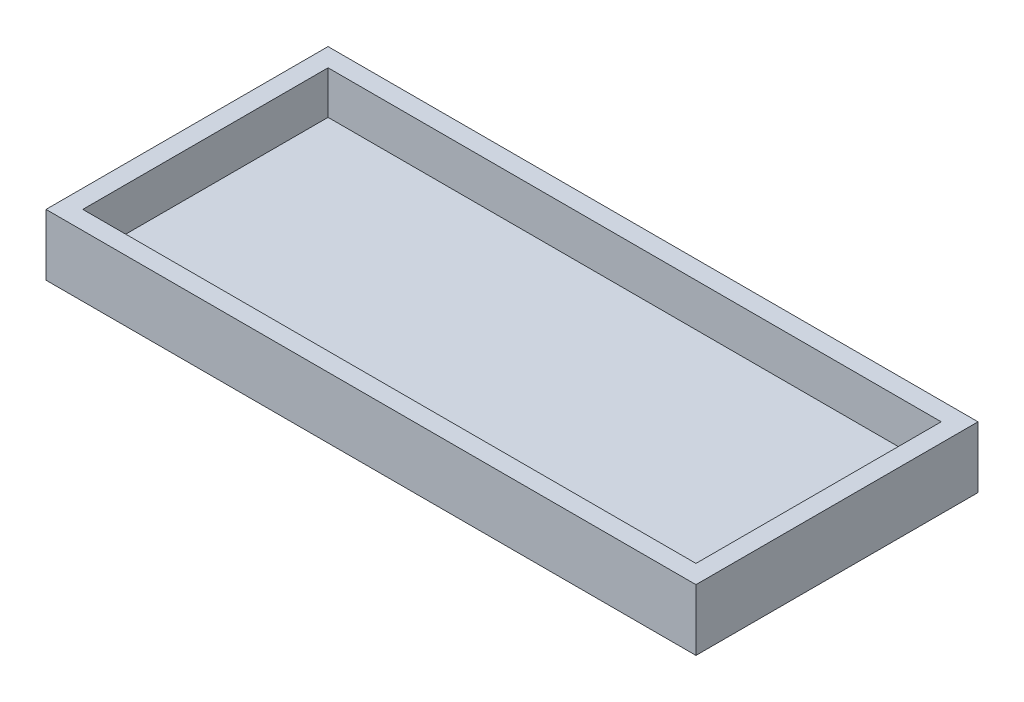
ISO-10303-21;
HEADER;
FILE_DESCRIPTION(('STEP AP214'),'2;1');
FILE_NAME('part.step','',(''),(''),'','','');
FILE_SCHEMA(('AUTOMOTIVE_DESIGN { 1 0 10303 214 1 1 1 1 }'));
ENDSEC;
DATA;
#1=APPLICATION_CONTEXT('core data for automotive mechanical design processes');
#2=APPLICATION_PROTOCOL_DEFINITION('international standard','automotive_design',2000,#1);
#3=PRODUCT_CONTEXT('',#1,'mechanical');
#4=PRODUCT('Part','Part','',(#3));
#5=PRODUCT_RELATED_PRODUCT_CATEGORY('part','',(#4));
#6=PRODUCT_DEFINITION_FORMATION('','',#4);
#7=PRODUCT_DEFINITION_CONTEXT('part definition',#1,'design');
#8=PRODUCT_DEFINITION('design','',#6,#7);
#9=PRODUCT_DEFINITION_SHAPE('','',#8);
#10=(LENGTH_UNIT() NAMED_UNIT(*) SI_UNIT(.MILLI.,.METRE.));
#11=(NAMED_UNIT(*) PLANE_ANGLE_UNIT() SI_UNIT($,.RADIAN.));
#12=(NAMED_UNIT(*) SI_UNIT($,.STERADIAN.) SOLID_ANGLE_UNIT());
#13=UNCERTAINTY_MEASURE_WITH_UNIT(LENGTH_MEASURE(1.E-05),#10,'distance_accuracy_value','');
#14=(GEOMETRIC_REPRESENTATION_CONTEXT(3) GLOBAL_UNCERTAINTY_ASSIGNED_CONTEXT((#13)) GLOBAL_UNIT_ASSIGNED_CONTEXT((#10,
#11,#12)) REPRESENTATION_CONTEXT('',''));
#15=CARTESIAN_POINT('',(0.,0.,0.));
#16=DIRECTION('',(0.,0.,1.));
#17=DIRECTION('',(1.,0.,0.));
#18=AXIS2_PLACEMENT_3D('',#15,#16,#17);
#19=CARTESIAN_POINT('',(53.,10.,23.));
#20=DIRECTION('',(-1.,0.,0.));
#21=DIRECTION('',(0.,0.,1.));
#22=AXIS2_PLACEMENT_3D('',#19,#20,#21);
#23=PLANE('',#22);
#24=DIRECTION('',(0.,0.,-1.));
#25=VECTOR('',#24,1.);
#26=CARTESIAN_POINT('',(53.,0.,23.));
#27=LINE('',#26,#25);
#28=CARTESIAN_POINT('',(53.,0.,23.));
#29=VERTEX_POINT('',#28);
#30=CARTESIAN_POINT('',(53.,0.,-23.));
#31=VERTEX_POINT('',#30);
#32=EDGE_CURVE('E140',#29,#31,#27,.T.);
#33=ORIENTED_EDGE('',*,*,#32,.T.);
#34=DIRECTION('',(0.,-1.,0.));
#35=VECTOR('',#34,1.);
#36=CARTESIAN_POINT('',(53.,10.,-23.));
#37=LINE('',#36,#35);
#38=CARTESIAN_POINT('',(53.,10.,-23.));
#39=VERTEX_POINT('',#38);
#40=EDGE_CURVE('E11',#39,#31,#37,.T.);
#41=ORIENTED_EDGE('',*,*,#40,.F.);
#42=DIRECTION('',(0.,0.,-1.));
#43=VECTOR('',#42,1.);
#44=CARTESIAN_POINT('',(53.,10.,23.));
#45=LINE('',#44,#43);
#46=CARTESIAN_POINT('',(53.,10.,23.));
#47=VERTEX_POINT('',#46);
#48=EDGE_CURVE('E144',#47,#39,#45,.T.);
#49=ORIENTED_EDGE('',*,*,#48,.F.);
#50=DIRECTION('',(0.,-1.,0.));
#51=VECTOR('',#50,1.);
#52=CARTESIAN_POINT('',(53.,10.,23.));
#53=LINE('',#52,#51);
#54=EDGE_CURVE('E150',#47,#29,#53,.T.);
#55=ORIENTED_EDGE('',*,*,#54,.T.);
#56=EDGE_LOOP('',(#33,#41,#49,#55));
#57=FACE_BOUND('',#56,.T.);
#58=ADVANCED_FACE('F32',(#57),#23,.F.);
#59=CARTESIAN_POINT('',(-53.,10.,-23.));
#60=DIRECTION('',(0.,0.,1.));
#61=DIRECTION('',(1.,0.,0.));
#62=AXIS2_PLACEMENT_3D('',#59,#60,#61);
#63=PLANE('',#62);
#64=DIRECTION('',(-1.,0.,0.));
#65=VECTOR('',#64,1.);
#66=CARTESIAN_POINT('',(-53.,0.,-23.));
#67=LINE('',#66,#65);
#68=CARTESIAN_POINT('',(-53.,0.,-23.));
#69=VERTEX_POINT('',#68);
#70=EDGE_CURVE('E153',#31,#69,#67,.T.);
#71=ORIENTED_EDGE('',*,*,#70,.T.);
#72=DIRECTION('',(0.,-1.,0.));
#73=VECTOR('',#72,1.);
#74=CARTESIAN_POINT('',(-53.,10.,-23.));
#75=LINE('',#74,#73);
#76=CARTESIAN_POINT('',(-53.,10.,-23.));
#77=VERTEX_POINT('',#76);
#78=EDGE_CURVE('E39',#77,#69,#75,.T.);
#79=ORIENTED_EDGE('',*,*,#78,.F.);
#80=DIRECTION('',(-1.,0.,0.));
#81=VECTOR('',#80,1.);
#82=CARTESIAN_POINT('',(-53.,10.,-23.));
#83=LINE('',#82,#81);
#84=EDGE_CURVE('E83',#39,#77,#83,.T.);
#85=ORIENTED_EDGE('',*,*,#84,.F.);
#86=ORIENTED_EDGE('',*,*,#40,.T.);
#87=EDGE_LOOP('',(#71,#79,#85,#86));
#88=FACE_BOUND('',#87,.T.);
#89=ADVANCED_FACE('F182',(#88),#63,.F.);
#90=CARTESIAN_POINT('',(-53.,10.,23.));
#91=DIRECTION('',(1.,0.,0.));
#92=DIRECTION('',(0.,0.,-1.));
#93=AXIS2_PLACEMENT_3D('',#90,#91,#92);
#94=PLANE('',#93);
#95=DIRECTION('',(0.,0.,1.));
#96=VECTOR('',#95,1.);
#97=CARTESIAN_POINT('',(-53.,0.,23.));
#98=LINE('',#97,#96);
#99=CARTESIAN_POINT('',(-53.,0.,23.));
#100=VERTEX_POINT('',#99);
#101=EDGE_CURVE('E155',#69,#100,#98,.T.);
#102=ORIENTED_EDGE('',*,*,#101,.T.);
#103=DIRECTION('',(0.,-1.,0.));
#104=VECTOR('',#103,1.);
#105=CARTESIAN_POINT('',(-53.,10.,23.));
#106=LINE('',#105,#104);
#107=CARTESIAN_POINT('',(-53.,10.,23.));
#108=VERTEX_POINT('',#107);
#109=EDGE_CURVE('E159',#108,#100,#106,.T.);
#110=ORIENTED_EDGE('',*,*,#109,.F.);
#111=DIRECTION('',(0.,0.,1.));
#112=VECTOR('',#111,1.);
#113=CARTESIAN_POINT('',(-53.,10.,23.));
#114=LINE('',#113,#112);
#115=EDGE_CURVE('E147',#77,#108,#114,.T.);
#116=ORIENTED_EDGE('',*,*,#115,.F.);
#117=ORIENTED_EDGE('',*,*,#78,.T.);
#118=EDGE_LOOP('',(#102,#110,#116,#117));
#119=FACE_BOUND('',#118,.T.);
#120=ADVANCED_FACE('F164',(#119),#94,.F.);
#121=CARTESIAN_POINT('',(-53.,10.,23.));
#122=DIRECTION('',(0.,0.,-1.));
#123=DIRECTION('',(-1.,0.,0.));
#124=AXIS2_PLACEMENT_3D('',#121,#122,#123);
#125=PLANE('',#124);
#126=DIRECTION('',(1.,0.,0.));
#127=VECTOR('',#126,1.);
#128=CARTESIAN_POINT('',(-53.,0.,23.));
#129=LINE('',#128,#127);
#130=EDGE_CURVE('E76',#100,#29,#129,.T.);
#131=ORIENTED_EDGE('',*,*,#130,.T.);
#132=ORIENTED_EDGE('',*,*,#54,.F.);
#133=DIRECTION('',(1.,0.,0.));
#134=VECTOR('',#133,1.);
#135=CARTESIAN_POINT('',(-53.,10.,23.));
#136=LINE('',#135,#134);
#137=EDGE_CURVE('E55',#108,#47,#136,.T.);
#138=ORIENTED_EDGE('',*,*,#137,.F.);
#139=ORIENTED_EDGE('',*,*,#109,.T.);
#140=EDGE_LOOP('',(#131,#132,#138,#139));
#141=FACE_BOUND('',#140,.T.);
#142=ADVANCED_FACE('F172',(#141),#125,.F.);
#143=CARTESIAN_POINT('',(0.,10.,0.));
#144=DIRECTION('',(0.,-1.,0.));
#145=DIRECTION('',(0.,0.,-1.));
#146=AXIS2_PLACEMENT_3D('',#143,#144,#145);
#147=PLANE('',#146);
#148=DIRECTION('',(-1.,0.,0.));
#149=VECTOR('',#148,1.);
#150=CARTESIAN_POINT('',(-50.,10.,-20.));
#151=LINE('',#150,#149);
#152=CARTESIAN_POINT('',(50.,10.,-20.));
#153=VERTEX_POINT('',#152);
#154=CARTESIAN_POINT('',(-50.,10.,-20.));
#155=VERTEX_POINT('',#154);
#156=EDGE_CURVE('E134',#153,#155,#151,.T.);
#157=ORIENTED_EDGE('',*,*,#156,.F.);
#158=DIRECTION('',(0.,0.,-1.));
#159=VECTOR('',#158,1.);
#160=CARTESIAN_POINT('',(50.,10.,20.));
#161=LINE('',#160,#159);
#162=CARTESIAN_POINT('',(50.,10.,20.));
#163=VERTEX_POINT('',#162);
#164=EDGE_CURVE('E46',#163,#153,#161,.T.);
#165=ORIENTED_EDGE('',*,*,#164,.F.);
#166=DIRECTION('',(1.,0.,0.));
#167=VECTOR('',#166,1.);
#168=CARTESIAN_POINT('',(-50.,10.,20.));
#169=LINE('',#168,#167);
#170=CARTESIAN_POINT('',(-50.,10.,20.));
#171=VERTEX_POINT('',#170);
#172=EDGE_CURVE('E125',#171,#163,#169,.T.);
#173=ORIENTED_EDGE('',*,*,#172,.F.);
#174=DIRECTION('',(0.,0.,1.));
#175=VECTOR('',#174,1.);
#176=CARTESIAN_POINT('',(-50.,10.,20.));
#177=LINE('',#176,#175);
#178=EDGE_CURVE('E128',#155,#171,#177,.T.);
#179=ORIENTED_EDGE('',*,*,#178,.F.);
#180=EDGE_LOOP('',(#157,#165,#173,#179));
#181=FACE_BOUND('',#180,.T.);
#182=ORIENTED_EDGE('',*,*,#48,.T.);
#183=ORIENTED_EDGE('',*,*,#84,.T.);
#184=ORIENTED_EDGE('',*,*,#115,.T.);
#185=ORIENTED_EDGE('',*,*,#137,.T.);
#186=EDGE_LOOP('',(#182,#183,#184,#185));
#187=FACE_BOUND('',#186,.T.);
#188=ADVANCED_FACE('F174',(#181,#187),#147,.F.);
#189=CARTESIAN_POINT('',(0.,0.,0.));
#190=DIRECTION('',(0.,-1.,0.));
#191=DIRECTION('',(0.,0.,-1.));
#192=AXIS2_PLACEMENT_3D('',#189,#190,#191);
#193=PLANE('',#192);
#194=ORIENTED_EDGE('',*,*,#32,.F.);
#195=ORIENTED_EDGE('',*,*,#130,.F.);
#196=ORIENTED_EDGE('',*,*,#101,.F.);
#197=ORIENTED_EDGE('',*,*,#70,.F.);
#198=EDGE_LOOP('',(#194,#195,#196,#197));
#199=FACE_BOUND('',#198,.T.);
#200=ADVANCED_FACE('F168',(#199),#193,.T.);
#201=CARTESIAN_POINT('',(50.,3.,20.));
#202=DIRECTION('',(1.,0.,0.));
#203=DIRECTION('',(0.,0.,-1.));
#204=AXIS2_PLACEMENT_3D('',#201,#202,#203);
#205=PLANE('',#204);
#206=ORIENTED_EDGE('',*,*,#164,.T.);
#207=DIRECTION('',(0.,1.,0.));
#208=VECTOR('',#207,1.);
#209=CARTESIAN_POINT('',(50.,3.,-20.));
#210=LINE('',#209,#208);
#211=CARTESIAN_POINT('',(50.,3.,-20.));
#212=VERTEX_POINT('',#211);
#213=EDGE_CURVE('E103',#212,#153,#210,.T.);
#214=ORIENTED_EDGE('',*,*,#213,.F.);
#215=DIRECTION('',(0.,0.,-1.));
#216=VECTOR('',#215,1.);
#217=CARTESIAN_POINT('',(50.,3.,20.));
#218=LINE('',#217,#216);
#219=CARTESIAN_POINT('',(50.,3.,20.));
#220=VERTEX_POINT('',#219);
#221=EDGE_CURVE('E107',#220,#212,#218,.T.);
#222=ORIENTED_EDGE('',*,*,#221,.F.);
#223=DIRECTION('',(0.,1.,0.));
#224=VECTOR('',#223,1.);
#225=CARTESIAN_POINT('',(50.,3.,20.));
#226=LINE('',#225,#224);
#227=EDGE_CURVE('E138',#220,#163,#226,.T.);
#228=ORIENTED_EDGE('',*,*,#227,.T.);
#229=EDGE_LOOP('',(#206,#214,#222,#228));
#230=FACE_BOUND('',#229,.T.);
#231=ADVANCED_FACE('F105',(#230),#205,.F.);
#232=CARTESIAN_POINT('',(-50.,3.,20.));
#233=DIRECTION('',(0.,0.,1.));
#234=DIRECTION('',(1.,0.,0.));
#235=AXIS2_PLACEMENT_3D('',#232,#233,#234);
#236=PLANE('',#235);
#237=ORIENTED_EDGE('',*,*,#172,.T.);
#238=ORIENTED_EDGE('',*,*,#227,.F.);
#239=DIRECTION('',(1.,0.,0.));
#240=VECTOR('',#239,1.);
#241=CARTESIAN_POINT('',(-50.,3.,20.));
#242=LINE('',#241,#240);
#243=CARTESIAN_POINT('',(-50.,3.,20.));
#244=VERTEX_POINT('',#243);
#245=EDGE_CURVE('E113',#244,#220,#242,.T.);
#246=ORIENTED_EDGE('',*,*,#245,.F.);
#247=DIRECTION('',(0.,1.,0.));
#248=VECTOR('',#247,1.);
#249=CARTESIAN_POINT('',(-50.,3.,20.));
#250=LINE('',#249,#248);
#251=EDGE_CURVE('E141',#244,#171,#250,.T.);
#252=ORIENTED_EDGE('',*,*,#251,.T.);
#253=EDGE_LOOP('',(#237,#238,#246,#252));
#254=FACE_BOUND('',#253,.T.);
#255=ADVANCED_FACE('F221',(#254),#236,.F.);
#256=CARTESIAN_POINT('',(-50.,3.,20.));
#257=DIRECTION('',(-1.,0.,0.));
#258=DIRECTION('',(0.,0.,1.));
#259=AXIS2_PLACEMENT_3D('',#256,#257,#258);
#260=PLANE('',#259);
#261=ORIENTED_EDGE('',*,*,#178,.T.);
#262=ORIENTED_EDGE('',*,*,#251,.F.);
#263=DIRECTION('',(0.,0.,1.));
#264=VECTOR('',#263,1.);
#265=CARTESIAN_POINT('',(-50.,3.,20.));
#266=LINE('',#265,#264);
#267=CARTESIAN_POINT('',(-50.,3.,-20.));
#268=VERTEX_POINT('',#267);
#269=EDGE_CURVE('E121',#268,#244,#266,.T.);
#270=ORIENTED_EDGE('',*,*,#269,.F.);
#271=DIRECTION('',(0.,1.,0.));
#272=VECTOR('',#271,1.);
#273=CARTESIAN_POINT('',(-50.,3.,-20.));
#274=LINE('',#273,#272);
#275=EDGE_CURVE('E112',#268,#155,#274,.T.);
#276=ORIENTED_EDGE('',*,*,#275,.T.);
#277=EDGE_LOOP('',(#261,#262,#270,#276));
#278=FACE_BOUND('',#277,.T.);
#279=ADVANCED_FACE('F230',(#278),#260,.F.);
#280=CARTESIAN_POINT('',(-50.,3.,-20.));
#281=DIRECTION('',(0.,0.,-1.));
#282=DIRECTION('',(-1.,0.,0.));
#283=AXIS2_PLACEMENT_3D('',#280,#281,#282);
#284=PLANE('',#283);
#285=ORIENTED_EDGE('',*,*,#156,.T.);
#286=ORIENTED_EDGE('',*,*,#275,.F.);
#287=DIRECTION('',(-1.,0.,0.));
#288=VECTOR('',#287,1.);
#289=CARTESIAN_POINT('',(-50.,3.,-20.));
#290=LINE('',#289,#288);
#291=EDGE_CURVE('E116',#212,#268,#290,.T.);
#292=ORIENTED_EDGE('',*,*,#291,.F.);
#293=ORIENTED_EDGE('',*,*,#213,.T.);
#294=EDGE_LOOP('',(#285,#286,#292,#293));
#295=FACE_BOUND('',#294,.T.);
#296=ADVANCED_FACE('F117',(#295),#284,.F.);
#297=CARTESIAN_POINT('',(0.,3.,0.));
#298=DIRECTION('',(0.,-1.,0.));
#299=DIRECTION('',(0.,0.,-1.));
#300=AXIS2_PLACEMENT_3D('',#297,#298,#299);
#301=PLANE('',#300);
#302=ORIENTED_EDGE('',*,*,#221,.T.);
#303=ORIENTED_EDGE('',*,*,#291,.T.);
#304=ORIENTED_EDGE('',*,*,#269,.T.);
#305=ORIENTED_EDGE('',*,*,#245,.T.);
#306=EDGE_LOOP('',(#302,#303,#304,#305));
#307=FACE_BOUND('',#306,.T.);
#308=ADVANCED_FACE('F123',(#307),#301,.F.);
#309=CLOSED_SHELL('',(#58,#89,#120,#142,#188,#200,#231,#255,#279,#296,#308));
#310=MANIFOLD_SOLID_BREP('B2',#309);
#311=ADVANCED_BREP_SHAPE_REPRESENTATION('',(#18,#310),#14);
#312=SHAPE_DEFINITION_REPRESENTATION(#9,#311);
ENDSEC;
END-ISO-10303-21;
